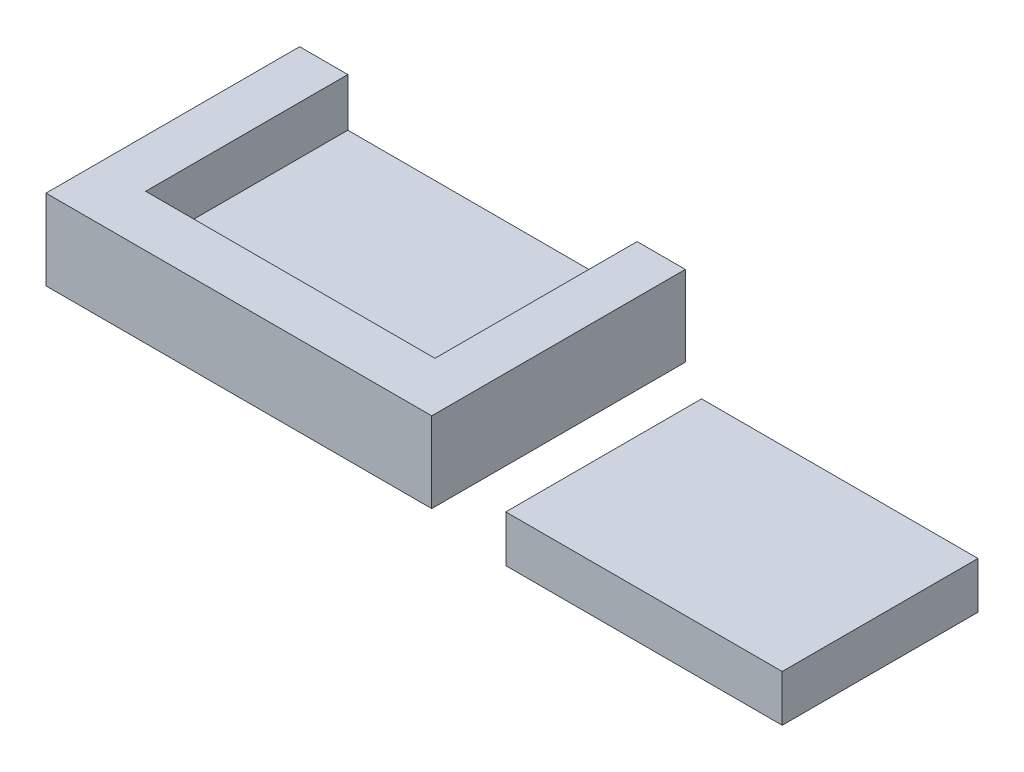
ISO-10303-21;
HEADER;
FILE_DESCRIPTION(('STEP AP214'),'2;1');
FILE_NAME('part.step','',(''),(''),'','','');
FILE_SCHEMA(('AUTOMOTIVE_DESIGN { 1 0 10303 214 1 1 1 1 }'));
ENDSEC;
DATA;
#1=APPLICATION_CONTEXT('core data for automotive mechanical design processes');
#2=APPLICATION_PROTOCOL_DEFINITION('international standard','automotive_design',2000,#1);
#3=PRODUCT_CONTEXT('',#1,'mechanical');
#4=PRODUCT('Part','Part','',(#3));
#5=PRODUCT_RELATED_PRODUCT_CATEGORY('part','',(#4));
#6=PRODUCT_DEFINITION_FORMATION('','',#4);
#7=PRODUCT_DEFINITION_CONTEXT('part definition',#1,'design');
#8=PRODUCT_DEFINITION('design','',#6,#7);
#9=PRODUCT_DEFINITION_SHAPE('','',#8);
#10=(LENGTH_UNIT() NAMED_UNIT(*) SI_UNIT(.MILLI.,.METRE.));
#11=(NAMED_UNIT(*) PLANE_ANGLE_UNIT() SI_UNIT($,.RADIAN.));
#12=(NAMED_UNIT(*) SI_UNIT($,.STERADIAN.) SOLID_ANGLE_UNIT());
#13=UNCERTAINTY_MEASURE_WITH_UNIT(LENGTH_MEASURE(1.E-05),#10,'distance_accuracy_value','');
#14=(GEOMETRIC_REPRESENTATION_CONTEXT(3) GLOBAL_UNCERTAINTY_ASSIGNED_CONTEXT((#13)) GLOBAL_UNIT_ASSIGNED_CONTEXT((#10,
#11,#12)) REPRESENTATION_CONTEXT('',''));
#15=CARTESIAN_POINT('',(0.,0.,0.));
#16=DIRECTION('',(0.,0.,1.));
#17=DIRECTION('',(1.,0.,0.));
#18=AXIS2_PLACEMENT_3D('',#15,#16,#17);
#19=CARTESIAN_POINT('',(29.3796478516116,2.9,0.772483214596394));
#20=DIRECTION('',(1.,0.,0.));
#21=DIRECTION('',(0.,0.,-1.));
#22=AXIS2_PLACEMENT_3D('',#19,#20,#21);
#23=PLANE('',#22);
#24=DIRECTION('',(0.,0.,1.));
#25=VECTOR('',#24,1.);
#26=CARTESIAN_POINT('',(29.3796478516116,0.,0.772483214596394));
#27=LINE('',#26,#25);
#28=CARTESIAN_POINT('',(29.3796478516116,0.,-11.4095167854036));
#29=VERTEX_POINT('',#28);
#30=CARTESIAN_POINT('',(29.3796478516116,0.,0.772483214596394));
#31=VERTEX_POINT('',#30);
#32=EDGE_CURVE('E118',#29,#31,#27,.T.);
#33=ORIENTED_EDGE('',*,*,#32,.T.);
#34=DIRECTION('',(0.,-1.,0.));
#35=VECTOR('',#34,1.);
#36=CARTESIAN_POINT('',(29.3796478516116,2.9,0.772483214596394));
#37=LINE('',#36,#35);
#38=CARTESIAN_POINT('',(29.3796478516116,2.9,0.772483214596394));
#39=VERTEX_POINT('',#38);
#40=EDGE_CURVE('E12',#39,#31,#37,.T.);
#41=ORIENTED_EDGE('',*,*,#40,.F.);
#42=DIRECTION('',(0.,0.,1.));
#43=VECTOR('',#42,1.);
#44=CARTESIAN_POINT('',(29.3796478516116,2.9,0.772483214596394));
#45=LINE('',#44,#43);
#46=CARTESIAN_POINT('',(29.3796478516116,2.9,-11.4095167854036));
#47=VERTEX_POINT('',#46);
#48=EDGE_CURVE('E106',#47,#39,#45,.T.);
#49=ORIENTED_EDGE('',*,*,#48,.F.);
#50=DIRECTION('',(0.,-1.,0.));
#51=VECTOR('',#50,1.);
#52=CARTESIAN_POINT('',(29.3796478516116,2.9,-11.4095167854036));
#53=LINE('',#52,#51);
#54=EDGE_CURVE('E114',#47,#29,#53,.T.);
#55=ORIENTED_EDGE('',*,*,#54,.T.);
#56=EDGE_LOOP('',(#33,#41,#49,#55));
#57=FACE_BOUND('',#56,.T.);
#58=ADVANCED_FACE('F55',(#57),#23,.F.);
#59=CARTESIAN_POINT('',(29.3796478516116,2.9,0.772483214596394));
#60=DIRECTION('',(0.,0.,-1.));
#61=DIRECTION('',(-1.,0.,0.));
#62=AXIS2_PLACEMENT_3D('',#59,#60,#61);
#63=PLANE('',#62);
#64=DIRECTION('',(1.,0.,0.));
#65=VECTOR('',#64,1.);
#66=CARTESIAN_POINT('',(29.3796478516116,0.,0.772483214596394));
#67=LINE('',#66,#65);
#68=CARTESIAN_POINT('',(46.5796478516116,0.,0.772483214596394));
#69=VERTEX_POINT('',#68);
#70=EDGE_CURVE('E110',#31,#69,#67,.T.);
#71=ORIENTED_EDGE('',*,*,#70,.T.);
#72=DIRECTION('',(0.,-1.,0.));
#73=VECTOR('',#72,1.);
#74=CARTESIAN_POINT('',(46.5796478516116,2.9,0.772483214596394));
#75=LINE('',#74,#73);
#76=CARTESIAN_POINT('',(46.5796478516116,2.9,0.772483214596394));
#77=VERTEX_POINT('',#76);
#78=EDGE_CURVE('E63',#77,#69,#75,.T.);
#79=ORIENTED_EDGE('',*,*,#78,.F.);
#80=DIRECTION('',(1.,0.,0.));
#81=VECTOR('',#80,1.);
#82=CARTESIAN_POINT('',(29.3796478516116,2.9,0.772483214596394));
#83=LINE('',#82,#81);
#84=EDGE_CURVE('E101',#39,#77,#83,.T.);
#85=ORIENTED_EDGE('',*,*,#84,.F.);
#86=ORIENTED_EDGE('',*,*,#40,.T.);
#87=EDGE_LOOP('',(#71,#79,#85,#86));
#88=FACE_BOUND('',#87,.T.);
#89=ADVANCED_FACE('F109',(#88),#63,.F.);
#90=CARTESIAN_POINT('',(46.5796478516116,2.9,0.772483214596394));
#91=DIRECTION('',(-1.,0.,0.));
#92=DIRECTION('',(0.,0.,1.));
#93=AXIS2_PLACEMENT_3D('',#90,#91,#92);
#94=PLANE('',#93);
#95=DIRECTION('',(0.,0.,-1.));
#96=VECTOR('',#95,1.);
#97=CARTESIAN_POINT('',(46.5796478516116,0.,0.772483214596394));
#98=LINE('',#97,#96);
#99=CARTESIAN_POINT('',(46.5796478516116,0.,-11.4095167854036));
#100=VERTEX_POINT('',#99);
#101=EDGE_CURVE('E88',#69,#100,#98,.T.);
#102=ORIENTED_EDGE('',*,*,#101,.T.);
#103=DIRECTION('',(0.,-1.,0.));
#104=VECTOR('',#103,1.);
#105=CARTESIAN_POINT('',(46.5796478516116,2.9,-11.4095167854036));
#106=LINE('',#105,#104);
#107=CARTESIAN_POINT('',(46.5796478516116,2.9,-11.4095167854036));
#108=VERTEX_POINT('',#107);
#109=EDGE_CURVE('E111',#108,#100,#106,.T.);
#110=ORIENTED_EDGE('',*,*,#109,.F.);
#111=DIRECTION('',(0.,0.,-1.));
#112=VECTOR('',#111,1.);
#113=CARTESIAN_POINT('',(46.5796478516116,2.9,0.772483214596394));
#114=LINE('',#113,#112);
#115=EDGE_CURVE('E104',#77,#108,#114,.T.);
#116=ORIENTED_EDGE('',*,*,#115,.F.);
#117=ORIENTED_EDGE('',*,*,#78,.T.);
#118=EDGE_LOOP('',(#102,#110,#116,#117));
#119=FACE_BOUND('',#118,.T.);
#120=ADVANCED_FACE('F112',(#119),#94,.F.);
#121=CARTESIAN_POINT('',(29.3796478516116,2.9,-11.4095167854036));
#122=DIRECTION('',(0.,0.,1.));
#123=DIRECTION('',(1.,0.,0.));
#124=AXIS2_PLACEMENT_3D('',#121,#122,#123);
#125=PLANE('',#124);
#126=DIRECTION('',(-1.,0.,0.));
#127=VECTOR('',#126,1.);
#128=CARTESIAN_POINT('',(29.3796478516116,0.,-11.4095167854036));
#129=LINE('',#128,#127);
#130=EDGE_CURVE('E94',#100,#29,#129,.T.);
#131=ORIENTED_EDGE('',*,*,#130,.T.);
#132=ORIENTED_EDGE('',*,*,#54,.F.);
#133=DIRECTION('',(-1.,0.,0.));
#134=VECTOR('',#133,1.);
#135=CARTESIAN_POINT('',(29.3796478516116,2.9,-11.4095167854036));
#136=LINE('',#135,#134);
#137=EDGE_CURVE('E71',#108,#47,#136,.T.);
#138=ORIENTED_EDGE('',*,*,#137,.F.);
#139=ORIENTED_EDGE('',*,*,#109,.T.);
#140=EDGE_LOOP('',(#131,#132,#138,#139));
#141=FACE_BOUND('',#140,.T.);
#142=ADVANCED_FACE('F125',(#141),#125,.F.);
#143=CARTESIAN_POINT('',(0.,2.9,0.));
#144=DIRECTION('',(0.,-1.,0.));
#145=DIRECTION('',(0.,0.,-1.));
#146=AXIS2_PLACEMENT_3D('',#143,#144,#145);
#147=PLANE('',#146);
#148=ORIENTED_EDGE('',*,*,#48,.T.);
#149=ORIENTED_EDGE('',*,*,#84,.T.);
#150=ORIENTED_EDGE('',*,*,#115,.T.);
#151=ORIENTED_EDGE('',*,*,#137,.T.);
#152=EDGE_LOOP('',(#148,#149,#150,#151));
#153=FACE_BOUND('',#152,.T.);
#154=ADVANCED_FACE('F102',(#153),#147,.F.);
#155=CARTESIAN_POINT('',(0.,0.,0.));
#156=DIRECTION('',(0.,-1.,0.));
#157=DIRECTION('',(0.,0.,-1.));
#158=AXIS2_PLACEMENT_3D('',#155,#156,#157);
#159=PLANE('',#158);
#160=ORIENTED_EDGE('',*,*,#32,.F.);
#161=ORIENTED_EDGE('',*,*,#130,.F.);
#162=ORIENTED_EDGE('',*,*,#101,.F.);
#163=ORIENTED_EDGE('',*,*,#70,.F.);
#164=EDGE_LOOP('',(#160,#161,#162,#163));
#165=FACE_BOUND('',#164,.T.);
#166=ADVANCED_FACE('F128',(#165),#159,.T.);
#167=CLOSED_SHELL('',(#58,#89,#120,#142,#154,#166));
#168=MANIFOLD_SOLID_BREP('B2',#167);
#169=CARTESIAN_POINT('',(0.,5.,0.));
#170=DIRECTION('',(1.,0.,0.));
#171=DIRECTION('',(0.,0.,-1.));
#172=AXIS2_PLACEMENT_3D('',#169,#170,#171);
#173=PLANE('',#172);
#174=DIRECTION('',(0.,0.,1.));
#175=VECTOR('',#174,1.);
#176=CARTESIAN_POINT('',(0.,0.,0.));
#177=LINE('',#176,#175);
#178=CARTESIAN_POINT('',(0.,0.,-15.78));
#179=VERTEX_POINT('',#178);
#180=CARTESIAN_POINT('',(0.,0.,0.));
#181=VERTEX_POINT('',#180);
#182=EDGE_CURVE('E293',#179,#181,#177,.T.);
#183=ORIENTED_EDGE('',*,*,#182,.T.);
#184=DIRECTION('',(0.,-1.,0.));
#185=VECTOR('',#184,1.);
#186=CARTESIAN_POINT('',(0.,5.,0.));
#187=LINE('',#186,#185);
#188=CARTESIAN_POINT('',(0.,5.,0.));
#189=VERTEX_POINT('',#188);
#190=EDGE_CURVE('E53',#189,#181,#187,.T.);
#191=ORIENTED_EDGE('',*,*,#190,.F.);
#192=DIRECTION('',(0.,0.,1.));
#193=VECTOR('',#192,1.);
#194=CARTESIAN_POINT('',(0.,5.,0.));
#195=LINE('',#194,#193);
#196=CARTESIAN_POINT('',(0.,5.,-15.78));
#197=VERTEX_POINT('',#196);
#198=EDGE_CURVE('E300',#197,#189,#195,.T.);
#199=ORIENTED_EDGE('',*,*,#198,.F.);
#200=DIRECTION('',(0.,-1.,0.));
#201=VECTOR('',#200,1.);
#202=CARTESIAN_POINT('',(0.,5.,-15.78));
#203=LINE('',#202,#201);
#204=EDGE_CURVE('E312',#197,#179,#203,.T.);
#205=ORIENTED_EDGE('',*,*,#204,.T.);
#206=EDGE_LOOP('',(#183,#191,#199,#205));
#207=FACE_BOUND('',#206,.T.);
#208=ADVANCED_FACE('F179',(#207),#173,.F.);
#209=CARTESIAN_POINT('',(0.,5.,0.));
#210=DIRECTION('',(0.,0.,-1.));
#211=DIRECTION('',(-1.,0.,0.));
#212=AXIS2_PLACEMENT_3D('',#209,#210,#211);
#213=PLANE('',#212);
#214=DIRECTION('',(1.,0.,0.));
#215=VECTOR('',#214,1.);
#216=CARTESIAN_POINT('',(0.,0.,0.));
#217=LINE('',#216,#215);
#218=CARTESIAN_POINT('',(24.,0.,0.));
#219=VERTEX_POINT('',#218);
#220=EDGE_CURVE('E316',#181,#219,#217,.T.);
#221=ORIENTED_EDGE('',*,*,#220,.T.);
#222=DIRECTION('',(0.,-1.,0.));
#223=VECTOR('',#222,1.);
#224=CARTESIAN_POINT('',(24.,5.,0.));
#225=LINE('',#224,#223);
#226=CARTESIAN_POINT('',(24.,5.,0.));
#227=VERTEX_POINT('',#226);
#228=EDGE_CURVE('E187',#227,#219,#225,.T.);
#229=ORIENTED_EDGE('',*,*,#228,.F.);
#230=DIRECTION('',(1.,0.,0.));
#231=VECTOR('',#230,1.);
#232=CARTESIAN_POINT('',(0.,5.,0.));
#233=LINE('',#232,#231);
#234=EDGE_CURVE('E231',#189,#227,#233,.T.);
#235=ORIENTED_EDGE('',*,*,#234,.F.);
#236=ORIENTED_EDGE('',*,*,#190,.T.);
#237=EDGE_LOOP('',(#221,#229,#235,#236));
#238=FACE_BOUND('',#237,.T.);
#239=ADVANCED_FACE('F358',(#238),#213,.F.);
#240=CARTESIAN_POINT('',(24.,5.,0.));
#241=DIRECTION('',(-1.,0.,0.));
#242=DIRECTION('',(0.,0.,1.));
#243=AXIS2_PLACEMENT_3D('',#240,#241,#242);
#244=PLANE('',#243);
#245=DIRECTION('',(0.,0.,-1.));
#246=VECTOR('',#245,1.);
#247=CARTESIAN_POINT('',(24.,0.,0.));
#248=LINE('',#247,#246);
#249=CARTESIAN_POINT('',(24.,0.,-15.78));
#250=VERTEX_POINT('',#249);
#251=EDGE_CURVE('E319',#219,#250,#248,.T.);
#252=ORIENTED_EDGE('',*,*,#251,.T.);
#253=DIRECTION('',(0.,-1.,0.));
#254=VECTOR('',#253,1.);
#255=CARTESIAN_POINT('',(24.,5.,-15.78));
#256=LINE('',#255,#254);
#257=CARTESIAN_POINT('',(24.,5.,-15.78));
#258=VERTEX_POINT('',#257);
#259=EDGE_CURVE('E326',#258,#250,#256,.T.);
#260=ORIENTED_EDGE('',*,*,#259,.F.);
#261=DIRECTION('',(0.,0.,-1.));
#262=VECTOR('',#261,1.);
#263=CARTESIAN_POINT('',(24.,5.,0.));
#264=LINE('',#263,#262);
#265=EDGE_CURVE('E305',#227,#258,#264,.T.);
#266=ORIENTED_EDGE('',*,*,#265,.F.);
#267=ORIENTED_EDGE('',*,*,#228,.T.);
#268=EDGE_LOOP('',(#252,#260,#266,#267));
#269=FACE_BOUND('',#268,.T.);
#270=ADVANCED_FACE('F333',(#269),#244,.F.);
#271=CARTESIAN_POINT('',(0.,5.,-15.78));
#272=DIRECTION('',(0.,0.,1.));
#273=DIRECTION('',(1.,0.,0.));
#274=AXIS2_PLACEMENT_3D('',#271,#272,#273);
#275=PLANE('',#274);
#276=DIRECTION('',(-1.,0.,0.));
#277=VECTOR('',#276,1.);
#278=CARTESIAN_POINT('',(0.,5.,-15.78));
#279=LINE('',#278,#277);
#280=CARTESIAN_POINT('',(3.,5.,-15.78));
#281=VERTEX_POINT('',#280);
#282=EDGE_CURVE('E202',#281,#197,#279,.T.);
#283=ORIENTED_EDGE('',*,*,#282,.F.);
#284=DIRECTION('',(0.,1.,0.));
#285=VECTOR('',#284,1.);
#286=CARTESIAN_POINT('',(3.,2.,-15.78));
#287=LINE('',#286,#285);
#288=CARTESIAN_POINT('',(3.,2.,-15.78));
#289=VERTEX_POINT('',#288);
#290=EDGE_CURVE('E290',#289,#281,#287,.T.);
#291=ORIENTED_EDGE('',*,*,#290,.F.);
#292=DIRECTION('',(-1.,0.,0.));
#293=VECTOR('',#292,1.);
#294=CARTESIAN_POINT('',(3.,2.,-15.78));
#295=LINE('',#294,#293);
#296=CARTESIAN_POINT('',(21.,2.,-15.78));
#297=VERTEX_POINT('',#296);
#298=EDGE_CURVE('E261',#297,#289,#295,.T.);
#299=ORIENTED_EDGE('',*,*,#298,.F.);
#300=DIRECTION('',(0.,1.,0.));
#301=VECTOR('',#300,1.);
#302=CARTESIAN_POINT('',(21.,2.,-15.78));
#303=LINE('',#302,#301);
#304=CARTESIAN_POINT('',(21.,5.,-15.78));
#305=VERTEX_POINT('',#304);
#306=EDGE_CURVE('E294',#297,#305,#303,.T.);
#307=ORIENTED_EDGE('',*,*,#306,.T.);
#308=EDGE_CURVE('E308',#258,#305,#279,.T.);
#309=ORIENTED_EDGE('',*,*,#308,.F.);
#310=ORIENTED_EDGE('',*,*,#259,.T.);
#311=DIRECTION('',(-1.,0.,0.));
#312=VECTOR('',#311,1.);
#313=CARTESIAN_POINT('',(0.,0.,-15.78));
#314=LINE('',#313,#312);
#315=EDGE_CURVE('E224',#250,#179,#314,.T.);
#316=ORIENTED_EDGE('',*,*,#315,.T.);
#317=ORIENTED_EDGE('',*,*,#204,.F.);
#318=EDGE_LOOP('',(#283,#291,#299,#307,#309,#310,#316,#317));
#319=FACE_BOUND('',#318,.T.);
#320=ADVANCED_FACE('F341',(#319),#275,.F.);
#321=CARTESIAN_POINT('',(0.,5.,0.));
#322=DIRECTION('',(0.,-1.,0.));
#323=DIRECTION('',(0.,0.,-1.));
#324=AXIS2_PLACEMENT_3D('',#321,#322,#323);
#325=PLANE('',#324);
#326=DIRECTION('',(1.,0.,0.));
#327=VECTOR('',#326,1.);
#328=CARTESIAN_POINT('',(3.,5.,-3.2));
#329=LINE('',#328,#327);
#330=CARTESIAN_POINT('',(3.,5.,-3.2));
#331=VERTEX_POINT('',#330);
#332=CARTESIAN_POINT('',(21.,5.,-3.2));
#333=VERTEX_POINT('',#332);
#334=EDGE_CURVE('E279',#331,#333,#329,.T.);
#335=ORIENTED_EDGE('',*,*,#334,.F.);
#336=DIRECTION('',(0.,0.,1.));
#337=VECTOR('',#336,1.);
#338=CARTESIAN_POINT('',(3.,5.,-15.78));
#339=LINE('',#338,#337);
#340=EDGE_CURVE('E194',#281,#331,#339,.T.);
#341=ORIENTED_EDGE('',*,*,#340,.F.);
#342=ORIENTED_EDGE('',*,*,#282,.T.);
#343=ORIENTED_EDGE('',*,*,#198,.T.);
#344=ORIENTED_EDGE('',*,*,#234,.T.);
#345=ORIENTED_EDGE('',*,*,#265,.T.);
#346=ORIENTED_EDGE('',*,*,#308,.T.);
#347=DIRECTION('',(0.,0.,-1.));
#348=VECTOR('',#347,1.);
#349=CARTESIAN_POINT('',(21.,5.,-15.78));
#350=LINE('',#349,#348);
#351=EDGE_CURVE('E276',#333,#305,#350,.T.);
#352=ORIENTED_EDGE('',*,*,#351,.F.);
#353=EDGE_LOOP('',(#335,#341,#342,#343,#344,#345,#346,#352));
#354=FACE_BOUND('',#353,.T.);
#355=ADVANCED_FACE('F343',(#354),#325,.F.);
#356=CARTESIAN_POINT('',(0.,0.,0.));
#357=DIRECTION('',(0.,-1.,0.));
#358=DIRECTION('',(0.,0.,-1.));
#359=AXIS2_PLACEMENT_3D('',#356,#357,#358);
#360=PLANE('',#359);
#361=ORIENTED_EDGE('',*,*,#182,.F.);
#362=ORIENTED_EDGE('',*,*,#315,.F.);
#363=ORIENTED_EDGE('',*,*,#251,.F.);
#364=ORIENTED_EDGE('',*,*,#220,.F.);
#365=EDGE_LOOP('',(#361,#362,#363,#364));
#366=FACE_BOUND('',#365,.T.);
#367=ADVANCED_FACE('F337',(#366),#360,.T.);
#368=CARTESIAN_POINT('',(3.,2.,-15.78));
#369=DIRECTION('',(-1.,0.,0.));
#370=DIRECTION('',(0.,0.,1.));
#371=AXIS2_PLACEMENT_3D('',#368,#369,#370);
#372=PLANE('',#371);
#373=ORIENTED_EDGE('',*,*,#340,.T.);
#374=DIRECTION('',(0.,1.,0.));
#375=VECTOR('',#374,1.);
#376=CARTESIAN_POINT('',(3.,2.,-3.2));
#377=LINE('',#376,#375);
#378=CARTESIAN_POINT('',(3.,2.,-3.2));
#379=VERTEX_POINT('',#378);
#380=EDGE_CURVE('E250',#379,#331,#377,.T.);
#381=ORIENTED_EDGE('',*,*,#380,.F.);
#382=DIRECTION('',(0.,0.,1.));
#383=VECTOR('',#382,1.);
#384=CARTESIAN_POINT('',(3.,2.,-15.78));
#385=LINE('',#384,#383);
#386=EDGE_CURVE('E254',#289,#379,#385,.T.);
#387=ORIENTED_EDGE('',*,*,#386,.F.);
#388=ORIENTED_EDGE('',*,*,#290,.T.);
#389=EDGE_LOOP('',(#373,#381,#387,#388));
#390=FACE_BOUND('',#389,.T.);
#391=ADVANCED_FACE('F252',(#390),#372,.F.);
#392=CARTESIAN_POINT('',(21.,2.,-15.78));
#393=DIRECTION('',(1.,0.,0.));
#394=DIRECTION('',(0.,0.,-1.));
#395=AXIS2_PLACEMENT_3D('',#392,#393,#394);
#396=PLANE('',#395);
#397=ORIENTED_EDGE('',*,*,#351,.T.);
#398=ORIENTED_EDGE('',*,*,#306,.F.);
#399=DIRECTION('',(0.,0.,-1.));
#400=VECTOR('',#399,1.);
#401=CARTESIAN_POINT('',(21.,2.,-15.78));
#402=LINE('',#401,#400);
#403=CARTESIAN_POINT('',(21.,2.,-3.2));
#404=VERTEX_POINT('',#403);
#405=EDGE_CURVE('E270',#404,#297,#402,.T.);
#406=ORIENTED_EDGE('',*,*,#405,.F.);
#407=DIRECTION('',(0.,1.,0.));
#408=VECTOR('',#407,1.);
#409=CARTESIAN_POINT('',(21.,2.,-3.2));
#410=LINE('',#409,#408);
#411=EDGE_CURVE('E260',#404,#333,#410,.T.);
#412=ORIENTED_EDGE('',*,*,#411,.T.);
#413=EDGE_LOOP('',(#397,#398,#406,#412));
#414=FACE_BOUND('',#413,.T.);
#415=ADVANCED_FACE('F347',(#414),#396,.F.);
#416=CARTESIAN_POINT('',(3.,2.,-3.2));
#417=DIRECTION('',(0.,0.,1.));
#418=DIRECTION('',(1.,0.,0.));
#419=AXIS2_PLACEMENT_3D('',#416,#417,#418);
#420=PLANE('',#419);
#421=ORIENTED_EDGE('',*,*,#334,.T.);
#422=ORIENTED_EDGE('',*,*,#411,.F.);
#423=DIRECTION('',(1.,0.,0.));
#424=VECTOR('',#423,1.);
#425=CARTESIAN_POINT('',(3.,2.,-3.2));
#426=LINE('',#425,#424);
#427=EDGE_CURVE('E264',#379,#404,#426,.T.);
#428=ORIENTED_EDGE('',*,*,#427,.F.);
#429=ORIENTED_EDGE('',*,*,#380,.T.);
#430=EDGE_LOOP('',(#421,#422,#428,#429));
#431=FACE_BOUND('',#430,.T.);
#432=ADVANCED_FACE('F265',(#431),#420,.F.);
#433=CARTESIAN_POINT('',(0.,2.,0.));
#434=DIRECTION('',(0.,1.,0.));
#435=DIRECTION('',(0.,0.,1.));
#436=AXIS2_PLACEMENT_3D('',#433,#434,#435);
#437=PLANE('',#436);
#438=ORIENTED_EDGE('',*,*,#386,.T.);
#439=ORIENTED_EDGE('',*,*,#427,.T.);
#440=ORIENTED_EDGE('',*,*,#405,.T.);
#441=ORIENTED_EDGE('',*,*,#298,.T.);
#442=EDGE_LOOP('',(#438,#439,#440,#441));
#443=FACE_BOUND('',#442,.T.);
#444=ADVANCED_FACE('F272',(#443),#437,.T.);
#445=CLOSED_SHELL('',(#208,#239,#270,#320,#355,#367,#391,#415,#432,#444));
#446=MANIFOLD_SOLID_BREP('B6',#445);
#447=ADVANCED_BREP_SHAPE_REPRESENTATION('',(#18,#168,#446),#14);
#448=SHAPE_DEFINITION_REPRESENTATION(#9,#447);
ENDSEC;
END-ISO-10303-21;
